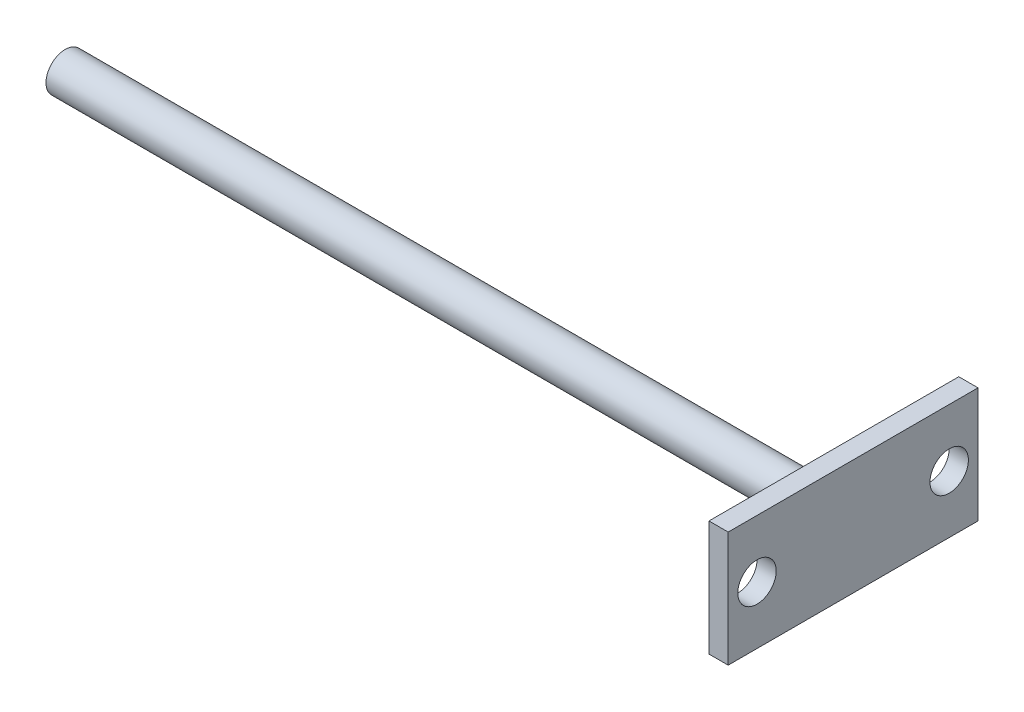
ISO-10303-21;
HEADER;
FILE_DESCRIPTION(('STEP AP214'),'2;1');
FILE_NAME('part.step','',(''),(''),'','','');
FILE_SCHEMA(('AUTOMOTIVE_DESIGN { 1 0 10303 214 1 1 1 1 }'));
ENDSEC;
DATA;
#1=APPLICATION_CONTEXT('core data for automotive mechanical design processes');
#2=APPLICATION_PROTOCOL_DEFINITION('international standard','automotive_design',2000,#1);
#3=PRODUCT_CONTEXT('',#1,'mechanical');
#4=PRODUCT('Part','Part','',(#3));
#5=PRODUCT_RELATED_PRODUCT_CATEGORY('part','',(#4));
#6=PRODUCT_DEFINITION_FORMATION('','',#4);
#7=PRODUCT_DEFINITION_CONTEXT('part definition',#1,'design');
#8=PRODUCT_DEFINITION('design','',#6,#7);
#9=PRODUCT_DEFINITION_SHAPE('','',#8);
#10=(LENGTH_UNIT() NAMED_UNIT(*) SI_UNIT(.MILLI.,.METRE.));
#11=(NAMED_UNIT(*) PLANE_ANGLE_UNIT() SI_UNIT($,.RADIAN.));
#12=(NAMED_UNIT(*) SI_UNIT($,.STERADIAN.) SOLID_ANGLE_UNIT());
#13=UNCERTAINTY_MEASURE_WITH_UNIT(LENGTH_MEASURE(1.E-05),#10,'distance_accuracy_value','');
#14=(GEOMETRIC_REPRESENTATION_CONTEXT(3) GLOBAL_UNCERTAINTY_ASSIGNED_CONTEXT((#13)) GLOBAL_UNIT_ASSIGNED_CONTEXT((#10,
#11,#12)) REPRESENTATION_CONTEXT('',''));
#15=CARTESIAN_POINT('',(0.,0.,0.));
#16=DIRECTION('',(0.,0.,1.));
#17=DIRECTION('',(1.,0.,0.));
#18=AXIS2_PLACEMENT_3D('',#15,#16,#17);
#19=CARTESIAN_POINT('',(-2.,3.,1.));
#20=DIRECTION('',(0.,-1.,0.));
#21=DIRECTION('',(0.,0.,-1.));
#22=AXIS2_PLACEMENT_3D('',#19,#20,#21);
#23=PLANE('',#22);
#24=DIRECTION('',(-1.,0.,0.));
#25=VECTOR('',#24,1.);
#26=CARTESIAN_POINT('',(3.,3.,-9.));
#27=LINE('',#26,#25);
#28=CARTESIAN_POINT('',(3.,3.,-9.));
#29=VERTEX_POINT('',#28);
#30=CARTESIAN_POINT('',(2.,3.,-9.));
#31=VERTEX_POINT('',#30);
#32=EDGE_CURVE('E96',#29,#31,#27,.T.);
#33=ORIENTED_EDGE('',*,*,#32,.T.);
#34=DIRECTION('',(0.,0.,-1.));
#35=VECTOR('',#34,1.);
#36=CARTESIAN_POINT('',(2.,3.,0.));
#37=LINE('',#36,#35);
#38=CARTESIAN_POINT('',(2.,3.,4.));
#39=VERTEX_POINT('',#38);
#40=EDGE_CURVE('E82',#39,#31,#37,.T.);
#41=ORIENTED_EDGE('',*,*,#40,.F.);
#42=DIRECTION('',(-1.,0.,0.));
#43=VECTOR('',#42,1.);
#44=CARTESIAN_POINT('',(3.,3.,4.));
#45=LINE('',#44,#43);
#46=CARTESIAN_POINT('',(3.,3.,4.));
#47=VERTEX_POINT('',#46);
#48=EDGE_CURVE('E56',#47,#39,#45,.T.);
#49=ORIENTED_EDGE('',*,*,#48,.F.);
#50=DIRECTION('',(0.,0.,-1.));
#51=VECTOR('',#50,1.);
#52=CARTESIAN_POINT('',(3.,3.,0.));
#53=LINE('',#52,#51);
#54=EDGE_CURVE('E74',#47,#29,#53,.T.);
#55=ORIENTED_EDGE('',*,*,#54,.T.);
#56=EDGE_LOOP('',(#33,#41,#49,#55));
#57=FACE_BOUND('',#56,.T.);
#58=ADVANCED_FACE('F40',(#57),#23,.F.);
#59=CARTESIAN_POINT('',(-2.,-3.,1.));
#60=DIRECTION('',(0.,1.,0.));
#61=DIRECTION('',(0.,0.,1.));
#62=AXIS2_PLACEMENT_3D('',#59,#60,#61);
#63=PLANE('',#62);
#64=DIRECTION('',(0.,0.,-1.));
#65=VECTOR('',#64,1.);
#66=CARTESIAN_POINT('',(2.,-3.,0.));
#67=LINE('',#66,#65);
#68=CARTESIAN_POINT('',(2.,-3.,4.));
#69=VERTEX_POINT('',#68);
#70=CARTESIAN_POINT('',(2.,-3.,-9.));
#71=VERTEX_POINT('',#70);
#72=EDGE_CURVE('E68',#69,#71,#67,.T.);
#73=ORIENTED_EDGE('',*,*,#72,.T.);
#74=DIRECTION('',(-1.,0.,0.));
#75=VECTOR('',#74,1.);
#76=CARTESIAN_POINT('',(3.,-3.,-9.));
#77=LINE('',#76,#75);
#78=CARTESIAN_POINT('',(3.,-3.,-9.));
#79=VERTEX_POINT('',#78);
#80=EDGE_CURVE('E98',#79,#71,#77,.T.);
#81=ORIENTED_EDGE('',*,*,#80,.F.);
#82=DIRECTION('',(0.,0.,-1.));
#83=VECTOR('',#82,1.);
#84=CARTESIAN_POINT('',(3.,-3.,0.));
#85=LINE('',#84,#83);
#86=CARTESIAN_POINT('',(3.,-3.,4.));
#87=VERTEX_POINT('',#86);
#88=EDGE_CURVE('E114',#87,#79,#85,.T.);
#89=ORIENTED_EDGE('',*,*,#88,.F.);
#90=DIRECTION('',(-1.,0.,0.));
#91=VECTOR('',#90,1.);
#92=CARTESIAN_POINT('',(3.,-3.,4.));
#93=LINE('',#92,#91);
#94=EDGE_CURVE('E48',#87,#69,#93,.T.);
#95=ORIENTED_EDGE('',*,*,#94,.T.);
#96=EDGE_LOOP('',(#73,#81,#89,#95));
#97=FACE_BOUND('',#96,.T.);
#98=ADVANCED_FACE('F123',(#97),#63,.F.);
#99=CARTESIAN_POINT('',(2.,0.,0.));
#100=DIRECTION('',(1.,0.,0.));
#101=DIRECTION('',(0.,1.,0.));
#102=AXIS2_PLACEMENT_3D('',#99,#100,#101);
#103=PLANE('',#102);
#104=CARTESIAN_POINT('',(2.,0.,-2.5));
#105=DIRECTION('',(1.,0.,0.));
#106=DIRECTION('',(0.,1.,0.));
#107=AXIS2_PLACEMENT_3D('',#104,#105,#106);
#108=CIRCLE('',#107,1.);
#109=CARTESIAN_POINT('',(2.,1.,-2.5));
#110=VERTEX_POINT('',#109);
#111=EDGE_CURVE('E11',#110,#110,#108,.F.);
#112=ORIENTED_EDGE('',*,*,#111,.F.);
#113=EDGE_LOOP('',(#112));
#114=FACE_BOUND('',#113,.T.);
#115=DIRECTION('',(0.,-1.,0.));
#116=VECTOR('',#115,1.);
#117=CARTESIAN_POINT('',(2.,0.,-9.));
#118=LINE('',#117,#116);
#119=EDGE_CURVE('E86',#31,#71,#118,.T.);
#120=ORIENTED_EDGE('',*,*,#119,.T.);
#121=ORIENTED_EDGE('',*,*,#72,.F.);
#122=DIRECTION('',(0.,-1.,0.));
#123=VECTOR('',#122,1.);
#124=CARTESIAN_POINT('',(2.,0.,4.));
#125=LINE('',#124,#123);
#126=EDGE_CURVE('E89',#39,#69,#125,.T.);
#127=ORIENTED_EDGE('',*,*,#126,.F.);
#128=ORIENTED_EDGE('',*,*,#40,.T.);
#129=EDGE_LOOP('',(#120,#121,#127,#128));
#130=FACE_BOUND('',#129,.T.);
#131=CARTESIAN_POINT('',(2.,0.,-7.5));
#132=DIRECTION('',(-1.,0.,0.));
#133=DIRECTION('',(0.,1.,0.));
#134=AXIS2_PLACEMENT_3D('',#131,#132,#133);
#135=CIRCLE('',#134,1.);
#136=CARTESIAN_POINT('',(2.,1.,-7.5));
#137=VERTEX_POINT('',#136);
#138=EDGE_CURVE('E100',#137,#137,#135,.T.);
#139=ORIENTED_EDGE('',*,*,#138,.F.);
#140=EDGE_LOOP('',(#139));
#141=FACE_BOUND('',#140,.T.);
#142=CARTESIAN_POINT('',(2.,0.,2.5));
#143=DIRECTION('',(1.,0.,0.));
#144=DIRECTION('',(0.,1.,0.));
#145=AXIS2_PLACEMENT_3D('',#142,#143,#144);
#146=CIRCLE('',#145,1.);
#147=CARTESIAN_POINT('',(2.,1.,2.5));
#148=VERTEX_POINT('',#147);
#149=EDGE_CURVE('E104',#148,#148,#146,.T.);
#150=ORIENTED_EDGE('',*,*,#149,.T.);
#151=EDGE_LOOP('',(#150));
#152=FACE_BOUND('',#151,.T.);
#153=ADVANCED_FACE('F84',(#114,#130,#141,#152),#103,.F.);
#154=CARTESIAN_POINT('',(3.,0.,4.));
#155=DIRECTION('',(0.,0.,-1.));
#156=DIRECTION('',(0.,1.,0.));
#157=AXIS2_PLACEMENT_3D('',#154,#155,#156);
#158=PLANE('',#157);
#159=ORIENTED_EDGE('',*,*,#126,.T.);
#160=ORIENTED_EDGE('',*,*,#94,.F.);
#161=DIRECTION('',(0.,-1.,0.));
#162=VECTOR('',#161,1.);
#163=CARTESIAN_POINT('',(3.,0.,4.));
#164=LINE('',#163,#162);
#165=EDGE_CURVE('E111',#47,#87,#164,.T.);
#166=ORIENTED_EDGE('',*,*,#165,.F.);
#167=ORIENTED_EDGE('',*,*,#48,.T.);
#168=EDGE_LOOP('',(#159,#160,#166,#167));
#169=FACE_BOUND('',#168,.T.);
#170=ADVANCED_FACE('F125',(#169),#158,.F.);
#171=CARTESIAN_POINT('',(3.,0.,2.5));
#172=DIRECTION('',(-1.,0.,0.));
#173=DIRECTION('',(0.,-1.,0.));
#174=AXIS2_PLACEMENT_3D('',#171,#172,#173);
#175=CYLINDRICAL_SURFACE('',#174,1.);
#176=CARTESIAN_POINT('',(3.,0.,2.5));
#177=DIRECTION('',(1.,0.,0.));
#178=DIRECTION('',(0.,1.,0.));
#179=AXIS2_PLACEMENT_3D('',#176,#177,#178);
#180=CIRCLE('',#179,1.);
#181=CARTESIAN_POINT('',(3.,1.,2.5));
#182=VERTEX_POINT('',#181);
#183=EDGE_CURVE('E90',#182,#182,#180,.T.);
#184=ORIENTED_EDGE('',*,*,#183,.T.);
#185=EDGE_LOOP('',(#184));
#186=FACE_BOUND('',#185,.T.);
#187=ORIENTED_EDGE('',*,*,#149,.F.);
#188=EDGE_LOOP('',(#187));
#189=FACE_BOUND('',#188,.T.);
#190=ADVANCED_FACE('F130',(#186,#189),#175,.F.);
#191=CARTESIAN_POINT('',(3.,0.,0.));
#192=DIRECTION('',(1.,0.,0.));
#193=DIRECTION('',(0.,1.,0.));
#194=AXIS2_PLACEMENT_3D('',#191,#192,#193);
#195=PLANE('',#194);
#196=ORIENTED_EDGE('',*,*,#183,.F.);
#197=EDGE_LOOP('',(#196));
#198=FACE_BOUND('',#197,.T.);
#199=ORIENTED_EDGE('',*,*,#165,.T.);
#200=ORIENTED_EDGE('',*,*,#88,.T.);
#201=DIRECTION('',(0.,-1.,0.));
#202=VECTOR('',#201,1.);
#203=CARTESIAN_POINT('',(3.,0.,-9.));
#204=LINE('',#203,#202);
#205=EDGE_CURVE('E102',#29,#79,#204,.T.);
#206=ORIENTED_EDGE('',*,*,#205,.F.);
#207=ORIENTED_EDGE('',*,*,#54,.F.);
#208=EDGE_LOOP('',(#199,#200,#206,#207));
#209=FACE_BOUND('',#208,.T.);
#210=CARTESIAN_POINT('',(3.,0.,-7.5));
#211=DIRECTION('',(-1.,0.,0.));
#212=DIRECTION('',(0.,1.,0.));
#213=AXIS2_PLACEMENT_3D('',#210,#211,#212);
#214=CIRCLE('',#213,1.);
#215=CARTESIAN_POINT('',(3.,1.,-7.5));
#216=VERTEX_POINT('',#215);
#217=EDGE_CURVE('E99',#216,#216,#214,.T.);
#218=ORIENTED_EDGE('',*,*,#217,.T.);
#219=EDGE_LOOP('',(#218));
#220=FACE_BOUND('',#219,.T.);
#221=ADVANCED_FACE('F127',(#198,#209,#220),#195,.T.);
#222=CARTESIAN_POINT('',(3.,0.,-9.));
#223=DIRECTION('',(0.,0.,1.));
#224=DIRECTION('',(0.,1.,0.));
#225=AXIS2_PLACEMENT_3D('',#222,#223,#224);
#226=PLANE('',#225);
#227=ORIENTED_EDGE('',*,*,#119,.F.);
#228=ORIENTED_EDGE('',*,*,#32,.F.);
#229=ORIENTED_EDGE('',*,*,#205,.T.);
#230=ORIENTED_EDGE('',*,*,#80,.T.);
#231=EDGE_LOOP('',(#227,#228,#229,#230));
#232=FACE_BOUND('',#231,.T.);
#233=ADVANCED_FACE('F94',(#232),#226,.F.);
#234=CARTESIAN_POINT('',(3.,0.,-7.5));
#235=DIRECTION('',(-1.,0.,0.));
#236=DIRECTION('',(0.,-1.,0.));
#237=AXIS2_PLACEMENT_3D('',#234,#235,#236);
#238=CYLINDRICAL_SURFACE('',#237,1.);
#239=ORIENTED_EDGE('',*,*,#217,.F.);
#240=EDGE_LOOP('',(#239));
#241=FACE_BOUND('',#240,.T.);
#242=ORIENTED_EDGE('',*,*,#138,.T.);
#243=EDGE_LOOP('',(#242));
#244=FACE_BOUND('',#243,.T.);
#245=ADVANCED_FACE('F150',(#241,#244),#238,.F.);
#246=CARTESIAN_POINT('',(-38.,0.,-2.5));
#247=DIRECTION('',(1.,0.,0.));
#248=DIRECTION('',(0.,1.,0.));
#249=AXIS2_PLACEMENT_3D('',#246,#247,#248);
#250=CYLINDRICAL_SURFACE('',#249,1.);
#251=CARTESIAN_POINT('',(-38.,0.,-2.5));
#252=DIRECTION('',(-1.,0.,0.));
#253=DIRECTION('',(0.,-1.,0.));
#254=AXIS2_PLACEMENT_3D('',#251,#252,#253);
#255=CIRCLE('',#254,1.);
#256=CARTESIAN_POINT('',(-38.,-1.,-2.5));
#257=VERTEX_POINT('',#256);
#258=EDGE_CURVE('E138',#257,#257,#255,.T.);
#259=ORIENTED_EDGE('',*,*,#258,.F.);
#260=EDGE_LOOP('',(#259));
#261=FACE_BOUND('',#260,.T.);
#262=ORIENTED_EDGE('',*,*,#111,.T.);
#263=EDGE_LOOP('',(#262));
#264=FACE_BOUND('',#263,.T.);
#265=ADVANCED_FACE('F147',(#261,#264),#250,.T.);
#266=CARTESIAN_POINT('',(-38.,0.,0.));
#267=DIRECTION('',(-1.,0.,0.));
#268=DIRECTION('',(0.,-1.,0.));
#269=AXIS2_PLACEMENT_3D('',#266,#267,#268);
#270=PLANE('',#269);
#271=ORIENTED_EDGE('',*,*,#258,.T.);
#272=EDGE_LOOP('',(#271));
#273=FACE_BOUND('',#272,.T.);
#274=ADVANCED_FACE('F145',(#273),#270,.T.);
#275=CLOSED_SHELL('',(#58,#98,#153,#170,#190,#221,#233,#245,#265,#274));
#276=MANIFOLD_SOLID_BREP('B2',#275);
#277=ADVANCED_BREP_SHAPE_REPRESENTATION('',(#18,#276),#14);
#278=SHAPE_DEFINITION_REPRESENTATION(#9,#277);
ENDSEC;
END-ISO-10303-21;
